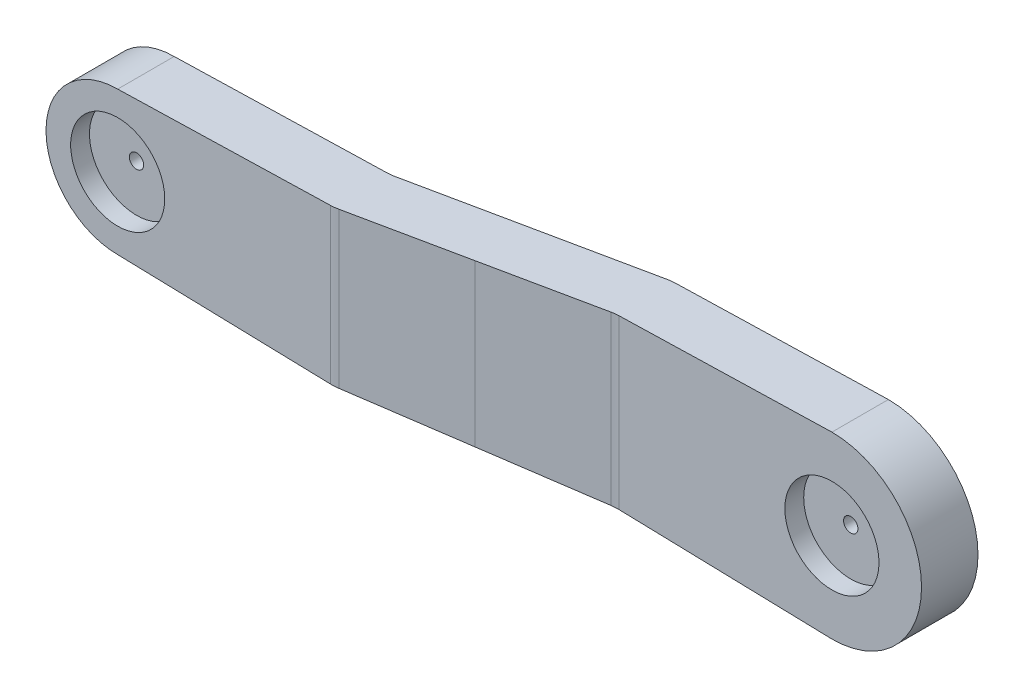
ISO-10303-21;
HEADER;
FILE_DESCRIPTION(('STEP AP214'),'2;1');
FILE_NAME('part.step','',(''),(''),'','','');
FILE_SCHEMA(('AUTOMOTIVE_DESIGN { 1 0 10303 214 1 1 1 1 }'));
ENDSEC;
DATA;
#1=APPLICATION_CONTEXT('core data for automotive mechanical design processes');
#2=APPLICATION_PROTOCOL_DEFINITION('international standard','automotive_design',2000,#1);
#3=PRODUCT_CONTEXT('',#1,'mechanical');
#4=PRODUCT('Part','Part','',(#3));
#5=PRODUCT_RELATED_PRODUCT_CATEGORY('part','',(#4));
#6=PRODUCT_DEFINITION_FORMATION('','',#4);
#7=PRODUCT_DEFINITION_CONTEXT('part definition',#1,'design');
#8=PRODUCT_DEFINITION('design','',#6,#7);
#9=PRODUCT_DEFINITION_SHAPE('','',#8);
#10=(LENGTH_UNIT() NAMED_UNIT(*) SI_UNIT(.MILLI.,.METRE.));
#11=(NAMED_UNIT(*) PLANE_ANGLE_UNIT() SI_UNIT($,.RADIAN.));
#12=(NAMED_UNIT(*) SI_UNIT($,.STERADIAN.) SOLID_ANGLE_UNIT());
#13=UNCERTAINTY_MEASURE_WITH_UNIT(LENGTH_MEASURE(1.E-05),#10,'distance_accuracy_value','');
#14=(GEOMETRIC_REPRESENTATION_CONTEXT(3) GLOBAL_UNCERTAINTY_ASSIGNED_CONTEXT((#13)) GLOBAL_UNIT_ASSIGNED_CONTEXT((#10,
#11,#12)) REPRESENTATION_CONTEXT('',''));
#15=CARTESIAN_POINT('',(0.,0.,0.));
#16=DIRECTION('',(0.,0.,1.));
#17=DIRECTION('',(1.,0.,0.));
#18=AXIS2_PLACEMENT_3D('',#15,#16,#17);
#19=CARTESIAN_POINT('',(0.,0.,22.));
#20=DIRECTION('',(0.,0.,-1.));
#21=DIRECTION('',(-1.,0.,0.));
#22=AXIS2_PLACEMENT_3D('',#19,#20,#21);
#23=CYLINDRICAL_SURFACE('',#22,16.);
#24=CARTESIAN_POINT('',(0.,0.,9.4));
#25=DIRECTION('',(0.,0.,-1.));
#26=DIRECTION('',(-1.,0.,0.));
#27=AXIS2_PLACEMENT_3D('',#24,#25,#26);
#28=CIRCLE('',#27,16.);
#29=CARTESIAN_POINT('',(0.,-16.,9.4));
#30=VERTEX_POINT('',#29);
#31=CARTESIAN_POINT('',(0.,16.,9.4));
#32=VERTEX_POINT('',#31);
#33=EDGE_CURVE('E148',#30,#32,#28,.T.);
#34=ORIENTED_EDGE('',*,*,#33,.F.);
#35=DIRECTION('',(0.,0.,-1.));
#36=VECTOR('',#35,1.);
#37=CARTESIAN_POINT('',(0.,-16.,22.));
#38=LINE('',#37,#36);
#39=CARTESIAN_POINT('',(0.,-16.,22.));
#40=VERTEX_POINT('',#39);
#41=EDGE_CURVE('E159',#40,#30,#38,.T.);
#42=ORIENTED_EDGE('',*,*,#41,.F.);
#43=CARTESIAN_POINT('',(0.,0.,22.));
#44=DIRECTION('',(0.,0.,1.));
#45=DIRECTION('',(1.,0.,0.));
#46=AXIS2_PLACEMENT_3D('',#43,#44,#45);
#47=CIRCLE('',#46,16.);
#48=CARTESIAN_POINT('',(0.,16.,22.));
#49=VERTEX_POINT('',#48);
#50=EDGE_CURVE('E268',#49,#40,#47,.T.);
#51=ORIENTED_EDGE('',*,*,#50,.F.);
#52=DIRECTION('',(0.,0.,-1.));
#53=VECTOR('',#52,1.);
#54=CARTESIAN_POINT('',(0.,16.,22.));
#55=LINE('',#54,#53);
#56=EDGE_CURVE('E161',#49,#32,#55,.T.);
#57=ORIENTED_EDGE('',*,*,#56,.T.);
#58=EDGE_LOOP('',(#34,#42,#51,#57));
#59=FACE_BOUND('',#58,.T.);
#60=ADVANCED_FACE('F42',(#59),#23,.T.);
#61=CARTESIAN_POINT('',(150.,0.,22.));
#62=DIRECTION('',(0.,0.,-1.));
#63=DIRECTION('',(-1.,0.,0.));
#64=AXIS2_PLACEMENT_3D('',#61,#62,#63);
#65=CYLINDRICAL_SURFACE('',#64,20.);
#66=CARTESIAN_POINT('',(150.,0.,12.6));
#67=DIRECTION('',(0.,0.,1.));
#68=DIRECTION('',(1.,0.,0.));
#69=AXIS2_PLACEMENT_3D('',#66,#67,#68);
#70=CIRCLE('',#69,20.);
#71=CARTESIAN_POINT('',(150.,-20.,12.6));
#72=VERTEX_POINT('',#71);
#73=CARTESIAN_POINT('',(150.,20.,12.6));
#74=VERTEX_POINT('',#73);
#75=EDGE_CURVE('E256',#72,#74,#70,.T.);
#76=ORIENTED_EDGE('',*,*,#75,.F.);
#77=DIRECTION('',(0.,0.,-1.));
#78=VECTOR('',#77,1.);
#79=CARTESIAN_POINT('',(150.,-20.,22.));
#80=LINE('',#79,#78);
#81=CARTESIAN_POINT('',(150.,-20.,0.));
#82=VERTEX_POINT('',#81);
#83=EDGE_CURVE('E169',#72,#82,#80,.T.);
#84=ORIENTED_EDGE('',*,*,#83,.T.);
#85=CARTESIAN_POINT('',(150.,0.,0.));
#86=DIRECTION('',(0.,0.,1.));
#87=DIRECTION('',(1.,0.,0.));
#88=AXIS2_PLACEMENT_3D('',#85,#86,#87);
#89=CIRCLE('',#88,20.);
#90=CARTESIAN_POINT('',(150.,20.,0.));
#91=VERTEX_POINT('',#90);
#92=EDGE_CURVE('E275',#82,#91,#89,.T.);
#93=ORIENTED_EDGE('',*,*,#92,.T.);
#94=DIRECTION('',(0.,0.,-1.));
#95=VECTOR('',#94,1.);
#96=CARTESIAN_POINT('',(150.,20.,22.));
#97=LINE('',#96,#95);
#98=EDGE_CURVE('E175',#74,#91,#97,.T.);
#99=ORIENTED_EDGE('',*,*,#98,.F.);
#100=EDGE_LOOP('',(#76,#84,#93,#99));
#101=FACE_BOUND('',#100,.T.);
#102=ADVANCED_FACE('F282',(#101),#65,.T.);
#103=CARTESIAN_POINT('',(150.,-20.,22.));
#104=DIRECTION('',(0.0266571902389806,0.999644633961771,0.));
#105=DIRECTION('',(-0.999644633961771,0.0266571902389806,0.));
#106=AXIS2_PLACEMENT_3D('',#103,#104,#105);
#107=PLANE('',#106);
#108=DIRECTION('',(-0.984468333130823,0.0262524888834886,0.173588328784053));
#109=VECTOR('',#108,1.);
#110=CARTESIAN_POINT('',(74.0695892170201,-17.9751890457872,4.86405652418145));
#111=LINE('',#110,#109);
#112=CARTESIAN_POINT('',(75.,-18.,4.69999999999999));
#113=VERTEX_POINT('',#112);
#114=CARTESIAN_POINT('',(100.793429410793,-18.6878247842878,0.151922469877921));
#115=VERTEX_POINT('',#114);
#116=EDGE_CURVE('E203',#113,#115,#111,.F.);
#117=ORIENTED_EDGE('',*,*,#116,.T.);
#118=CARTESIAN_POINT('',(102.529911187463,-18.734130964999,10.));
#119=DIRECTION('',(0.0266571902389806,0.999644633961771,0.));
#120=DIRECTION('',(-0.999644633961771,0.0266571902389806,0.));
#121=AXIS2_PLACEMENT_3D('',#118,#119,#120);
#122=ELLIPSE('',#121,10.0035549236814,10.);
#123=CARTESIAN_POINT('',(102.529911187463,-18.734130964999,0.));
#124=VERTEX_POINT('',#123);
#125=EDGE_CURVE('E220',#115,#124,#122,.F.);
#126=ORIENTED_EDGE('',*,*,#125,.T.);
#127=DIRECTION('',(0.999644633961771,-0.0266571902389806,0.));
#128=VECTOR('',#127,1.);
#129=CARTESIAN_POINT('',(150.,-20.,0.));
#130=LINE('',#129,#128);
#131=EDGE_CURVE('E265',#124,#82,#130,.T.);
#132=ORIENTED_EDGE('',*,*,#131,.T.);
#133=ORIENTED_EDGE('',*,*,#83,.F.);
#134=DIRECTION('',(0.999644633961771,-0.0266571902389805,0.));
#135=VECTOR('',#134,1.);
#136=CARTESIAN_POINT('',(75.,-18.,12.6));
#137=LINE('',#136,#135);
#138=CARTESIAN_POINT('',(102.529911187463,-18.734130964999,12.6));
#139=VERTEX_POINT('',#138);
#140=EDGE_CURVE('E237',#139,#72,#137,.T.);
#141=ORIENTED_EDGE('',*,*,#140,.F.);
#142=CARTESIAN_POINT('',(102.529911187463,-18.734130964999,22.6));
#143=DIRECTION('',(0.0266571902389806,0.999644633961771,0.));
#144=DIRECTION('',(0.999644633961771,-0.0266571902389806,0.));
#145=AXIS2_PLACEMENT_3D('',#142,#143,#144);
#146=ELLIPSE('',#145,10.0035549236814,10.);
#147=CARTESIAN_POINT('',(100.793429410794,-18.6878247842878,12.7519224698779));
#148=VERTEX_POINT('',#147);
#149=EDGE_CURVE('E50',#139,#148,#146,.T.);
#150=ORIENTED_EDGE('',*,*,#149,.T.);
#151=DIRECTION('',(-0.984468333130824,0.0262524888834887,0.173588328784047));
#152=VECTOR('',#151,1.);
#153=CARTESIAN_POINT('',(146.936838508609,-19.9183156935629,4.61559446406502));
#154=LINE('',#153,#152);
#155=CARTESIAN_POINT('',(75.,-18.,17.3));
#156=VERTEX_POINT('',#155);
#157=EDGE_CURVE('E189',#148,#156,#154,.T.);
#158=ORIENTED_EDGE('',*,*,#157,.T.);
#159=DIRECTION('',(-0.984468333130823,0.0262524888834886,0.173588328784053));
#160=VECTOR('',#159,1.);
#161=CARTESIAN_POINT('',(74.0695892170201,-17.9751890457872,17.4640565241814));
#162=LINE('',#161,#160);
#163=CARTESIAN_POINT('',(49.2065705892067,-17.3121752157122,21.8480775301221));
#164=VERTEX_POINT('',#163);
#165=EDGE_CURVE('E199',#156,#164,#162,.T.);
#166=ORIENTED_EDGE('',*,*,#165,.T.);
#167=CARTESIAN_POINT('',(47.4700888125374,-17.265869035001,12.));
#168=DIRECTION('',(0.0266571902389806,0.999644633961771,0.));
#169=DIRECTION('',(-0.999644633961771,0.0266571902389806,0.));
#170=AXIS2_PLACEMENT_3D('',#167,#168,#169);
#171=ELLIPSE('',#170,10.0035549236814,10.);
#172=CARTESIAN_POINT('',(47.4700888125374,-17.265869035001,22.));
#173=VERTEX_POINT('',#172);
#174=EDGE_CURVE('E57',#164,#173,#171,.F.);
#175=ORIENTED_EDGE('',*,*,#174,.T.);
#176=DIRECTION('',(0.999644633961771,-0.0266571902389806,0.));
#177=VECTOR('',#176,1.);
#178=CARTESIAN_POINT('',(150.,-20.,22.));
#179=LINE('',#178,#177);
#180=EDGE_CURVE('E166',#40,#173,#179,.T.);
#181=ORIENTED_EDGE('',*,*,#180,.F.);
#182=ORIENTED_EDGE('',*,*,#41,.T.);
#183=DIRECTION('',(-0.999644633961771,0.0266571902389806,0.));
#184=VECTOR('',#183,1.);
#185=CARTESIAN_POINT('',(75.,-18.,9.4));
#186=LINE('',#185,#184);
#187=CARTESIAN_POINT('',(47.4700888125366,-17.265869035001,9.4));
#188=VERTEX_POINT('',#187);
#189=EDGE_CURVE('E144',#188,#30,#186,.T.);
#190=ORIENTED_EDGE('',*,*,#189,.F.);
#191=CARTESIAN_POINT('',(47.4700888125366,-17.265869035001,-0.6));
#192=DIRECTION('',(0.0266571902389806,0.999644633961771,0.));
#193=DIRECTION('',(0.999644633961771,-0.0266571902389806,0.));
#194=AXIS2_PLACEMENT_3D('',#191,#192,#193);
#195=ELLIPSE('',#194,10.0035549236814,10.);
#196=CARTESIAN_POINT('',(49.2065705892058,-17.3121752157122,9.24807753012209));
#197=VERTEX_POINT('',#196);
#198=EDGE_CURVE('E231',#188,#197,#195,.T.);
#199=ORIENTED_EDGE('',*,*,#198,.T.);
#200=DIRECTION('',(0.984468333130824,-0.0262524888834887,-0.173588328784047));
#201=VECTOR('',#200,1.);
#202=CARTESIAN_POINT('',(144.783596628727,-19.8608959100994,-7.6047308965205));
#203=LINE('',#202,#201);
#204=EDGE_CURVE('E194',#197,#113,#203,.T.);
#205=ORIENTED_EDGE('',*,*,#204,.T.);
#206=EDGE_LOOP('',(#117,#126,#132,#133,#141,#150,#158,#166,#175,#181,#182,#190,#199,#205));
#207=FACE_BOUND('',#206,.T.);
#208=ADVANCED_FACE('F165',(#207),#107,.F.);
#209=CARTESIAN_POINT('',(0.,16.,22.));
#210=DIRECTION('',(0.0266571902389806,-0.999644633961771,0.));
#211=DIRECTION('',(0.999644633961771,0.0266571902389806,0.));
#212=AXIS2_PLACEMENT_3D('',#209,#210,#211);
#213=PLANE('',#212);
#214=DIRECTION('',(-0.999644633961771,-0.0266571902389806,0.));
#215=VECTOR('',#214,1.);
#216=CARTESIAN_POINT('',(0.,16.,0.));
#217=LINE('',#216,#215);
#218=CARTESIAN_POINT('',(102.529911187463,18.734130964999,0.));
#219=VERTEX_POINT('',#218);
#220=EDGE_CURVE('E270',#91,#219,#217,.T.);
#221=ORIENTED_EDGE('',*,*,#220,.T.);
#222=CARTESIAN_POINT('',(102.529911187463,18.734130964999,10.));
#223=DIRECTION('',(0.0266571902389806,-0.999644633961771,0.));
#224=DIRECTION('',(0.999644633961771,0.0266571902389806,0.));
#225=AXIS2_PLACEMENT_3D('',#222,#223,#224);
#226=ELLIPSE('',#225,10.0035549236814,10.);
#227=CARTESIAN_POINT('',(100.793429410793,18.6878247842878,0.15192246987792));
#228=VERTEX_POINT('',#227);
#229=EDGE_CURVE('E215',#219,#228,#226,.F.);
#230=ORIENTED_EDGE('',*,*,#229,.T.);
#231=DIRECTION('',(0.984468333130823,0.0262524888834886,-0.173588328784053));
#232=VECTOR('',#231,1.);
#233=CARTESIAN_POINT('',(75.,18.,4.70000000000001));
#234=LINE('',#233,#232);
#235=CARTESIAN_POINT('',(75.,18.,4.69999999999999));
#236=VERTEX_POINT('',#235);
#237=EDGE_CURVE('E205',#228,#236,#234,.F.);
#238=ORIENTED_EDGE('',*,*,#237,.T.);
#239=DIRECTION('',(-0.984468333130824,-0.0262524888834887,0.173588328784047));
#240=VECTOR('',#239,1.);
#241=CARTESIAN_POINT('',(-0.696467187766753,15.9814275416596,18.0473295095158));
#242=LINE('',#241,#240);
#243=CARTESIAN_POINT('',(49.2065705892058,17.3121752157122,9.24807753012209));
#244=VERTEX_POINT('',#243);
#245=EDGE_CURVE('E196',#236,#244,#242,.T.);
#246=ORIENTED_EDGE('',*,*,#245,.T.);
#247=CARTESIAN_POINT('',(47.4700888125366,17.265869035001,-0.6));
#248=DIRECTION('',(0.0266571902389806,-0.999644633961771,0.));
#249=DIRECTION('',(-0.999644633961771,-0.0266571902389806,0.));
#250=AXIS2_PLACEMENT_3D('',#247,#248,#249);
#251=ELLIPSE('',#250,10.0035549236814,10.);
#252=CARTESIAN_POINT('',(47.4700888125365,17.265869035001,9.4));
#253=VERTEX_POINT('',#252);
#254=EDGE_CURVE('E233',#244,#253,#251,.T.);
#255=ORIENTED_EDGE('',*,*,#254,.T.);
#256=DIRECTION('',(0.999644633961771,0.0266571902389806,0.));
#257=VECTOR('',#256,1.);
#258=CARTESIAN_POINT('',(0.,16.,9.4));
#259=LINE('',#258,#257);
#260=EDGE_CURVE('E153',#32,#253,#259,.T.);
#261=ORIENTED_EDGE('',*,*,#260,.F.);
#262=ORIENTED_EDGE('',*,*,#56,.F.);
#263=DIRECTION('',(-0.999644633961771,-0.0266571902389806,0.));
#264=VECTOR('',#263,1.);
#265=CARTESIAN_POINT('',(0.,16.,22.));
#266=LINE('',#265,#264);
#267=CARTESIAN_POINT('',(47.4700888125374,17.265869035001,22.));
#268=VERTEX_POINT('',#267);
#269=EDGE_CURVE('E272',#268,#49,#266,.T.);
#270=ORIENTED_EDGE('',*,*,#269,.F.);
#271=CARTESIAN_POINT('',(47.4700888125374,17.265869035001,12.));
#272=DIRECTION('',(0.0266571902389806,-0.999644633961771,0.));
#273=DIRECTION('',(0.999644633961771,0.0266571902389806,0.));
#274=AXIS2_PLACEMENT_3D('',#271,#272,#273);
#275=ELLIPSE('',#274,10.0035549236814,10.);
#276=CARTESIAN_POINT('',(49.2065705892067,17.3121752157122,21.8480775301221));
#277=VERTEX_POINT('',#276);
#278=EDGE_CURVE('E213',#268,#277,#275,.F.);
#279=ORIENTED_EDGE('',*,*,#278,.T.);
#280=DIRECTION('',(0.984468333130823,0.0262524888834886,-0.173588328784053));
#281=VECTOR('',#280,1.);
#282=CARTESIAN_POINT('',(75.,18.,17.3));
#283=LINE('',#282,#281);
#284=CARTESIAN_POINT('',(75.,18.,17.3));
#285=VERTEX_POINT('',#284);
#286=EDGE_CURVE('E201',#277,#285,#283,.T.);
#287=ORIENTED_EDGE('',*,*,#286,.T.);
#288=DIRECTION('',(0.984468333130824,0.0262524888834887,-0.173588328784047));
#289=VECTOR('',#288,1.);
#290=CARTESIAN_POINT('',(1.4567746921146,16.0388473251231,30.2676548701013));
#291=LINE('',#290,#289);
#292=CARTESIAN_POINT('',(100.793429410794,18.6878247842878,12.7519224698779));
#293=VERTEX_POINT('',#292);
#294=EDGE_CURVE('E191',#285,#293,#291,.T.);
#295=ORIENTED_EDGE('',*,*,#294,.T.);
#296=CARTESIAN_POINT('',(102.529911187463,18.734130964999,22.6));
#297=DIRECTION('',(0.0266571902389806,-0.999644633961771,0.));
#298=DIRECTION('',(-0.999644633961771,-0.0266571902389806,0.));
#299=AXIS2_PLACEMENT_3D('',#296,#297,#298);
#300=ELLIPSE('',#299,10.0035549236814,10.);
#301=CARTESIAN_POINT('',(102.529911187463,18.734130964999,12.6));
#302=VERTEX_POINT('',#301);
#303=EDGE_CURVE('E11',#293,#302,#300,.T.);
#304=ORIENTED_EDGE('',*,*,#303,.T.);
#305=DIRECTION('',(-0.999644633961771,-0.0266571902389805,0.));
#306=VECTOR('',#305,1.);
#307=CARTESIAN_POINT('',(150.,20.,12.6));
#308=LINE('',#307,#306);
#309=EDGE_CURVE('E162',#74,#302,#308,.T.);
#310=ORIENTED_EDGE('',*,*,#309,.F.);
#311=ORIENTED_EDGE('',*,*,#98,.T.);
#312=EDGE_LOOP('',(#221,#230,#238,#246,#255,#261,#262,#270,#279,#287,#295,#304,#310,#311));
#313=FACE_BOUND('',#312,.T.);
#314=ADVANCED_FACE('F251',(#313),#213,.F.);
#315=CARTESIAN_POINT('',(0.,0.,22.));
#316=DIRECTION('',(0.,0.,1.));
#317=DIRECTION('',(1.,0.,0.));
#318=AXIS2_PLACEMENT_3D('',#315,#316,#317);
#319=PLANE('',#318);
#320=ORIENTED_EDGE('',*,*,#180,.T.);
#321=DIRECTION('',(0.,1.,0.));
#322=VECTOR('',#321,1.);
#323=CARTESIAN_POINT('',(47.4700888125374,0.,22.));
#324=LINE('',#323,#322);
#325=EDGE_CURVE('E227',#173,#268,#324,.T.);
#326=ORIENTED_EDGE('',*,*,#325,.T.);
#327=ORIENTED_EDGE('',*,*,#269,.T.);
#328=ORIENTED_EDGE('',*,*,#50,.T.);
#329=EDGE_LOOP('',(#320,#326,#327,#328));
#330=FACE_BOUND('',#329,.T.);
#331=CARTESIAN_POINT('',(0.,0.,22.));
#332=DIRECTION('',(0.,0.,1.));
#333=DIRECTION('',(1.,0.,0.));
#334=AXIS2_PLACEMENT_3D('',#331,#332,#333);
#335=CIRCLE('',#334,10.5);
#336=CARTESIAN_POINT('',(10.5,0.,22.));
#337=VERTEX_POINT('',#336);
#338=EDGE_CURVE('E261',#337,#337,#335,.T.);
#339=ORIENTED_EDGE('',*,*,#338,.F.);
#340=EDGE_LOOP('',(#339));
#341=FACE_BOUND('',#340,.T.);
#342=ADVANCED_FACE('F345',(#330,#341),#319,.T.);
#343=CARTESIAN_POINT('',(0.,0.,0.));
#344=DIRECTION('',(0.,0.,1.));
#345=DIRECTION('',(1.,0.,0.));
#346=AXIS2_PLACEMENT_3D('',#343,#344,#345);
#347=PLANE('',#346);
#348=CARTESIAN_POINT('',(150.,0.,0.));
#349=DIRECTION('',(0.,0.,1.));
#350=DIRECTION('',(1.,0.,0.));
#351=AXIS2_PLACEMENT_3D('',#348,#349,#350);
#352=CIRCLE('',#351,1.59999999999999);
#353=CARTESIAN_POINT('',(151.6,0.,0.));
#354=VERTEX_POINT('',#353);
#355=EDGE_CURVE('E354',#354,#354,#352,.T.);
#356=ORIENTED_EDGE('',*,*,#355,.T.);
#357=EDGE_LOOP('',(#356));
#358=FACE_BOUND('',#357,.T.);
#359=ORIENTED_EDGE('',*,*,#131,.F.);
#360=DIRECTION('',(0.,-1.,0.));
#361=VECTOR('',#360,1.);
#362=CARTESIAN_POINT('',(102.529911187463,18.7108006547254,0.));
#363=LINE('',#362,#361);
#364=EDGE_CURVE('E210',#124,#219,#363,.F.);
#365=ORIENTED_EDGE('',*,*,#364,.T.);
#366=ORIENTED_EDGE('',*,*,#220,.F.);
#367=ORIENTED_EDGE('',*,*,#92,.F.);
#368=EDGE_LOOP('',(#359,#365,#366,#367));
#369=FACE_BOUND('',#368,.T.);
#370=ADVANCED_FACE('F285',(#358,#369),#347,.F.);
#371=CARTESIAN_POINT('',(0.,0.,17.8));
#372=DIRECTION('',(0.,0.,1.));
#373=DIRECTION('',(1.,0.,0.));
#374=AXIS2_PLACEMENT_3D('',#371,#372,#373);
#375=CYLINDRICAL_SURFACE('',#374,10.5);
#376=CARTESIAN_POINT('',(0.,0.,17.8));
#377=DIRECTION('',(0.,0.,1.));
#378=DIRECTION('',(1.,0.,0.));
#379=AXIS2_PLACEMENT_3D('',#376,#377,#378);
#380=CIRCLE('',#379,10.5);
#381=CARTESIAN_POINT('',(10.5,0.,17.8));
#382=VERTEX_POINT('',#381);
#383=EDGE_CURVE('E262',#382,#382,#380,.T.);
#384=ORIENTED_EDGE('',*,*,#383,.F.);
#385=EDGE_LOOP('',(#384));
#386=FACE_BOUND('',#385,.T.);
#387=ORIENTED_EDGE('',*,*,#338,.T.);
#388=EDGE_LOOP('',(#387));
#389=FACE_BOUND('',#388,.T.);
#390=ADVANCED_FACE('F364',(#386,#389),#375,.F.);
#391=CARTESIAN_POINT('',(0.,0.,17.8));
#392=DIRECTION('',(0.,0.,1.));
#393=DIRECTION('',(1.,0.,0.));
#394=AXIS2_PLACEMENT_3D('',#391,#392,#393);
#395=PLANE('',#394);
#396=CARTESIAN_POINT('',(0.,0.,17.8));
#397=DIRECTION('',(0.,0.,1.));
#398=DIRECTION('',(1.,0.,0.));
#399=AXIS2_PLACEMENT_3D('',#396,#397,#398);
#400=CIRCLE('',#399,1.6);
#401=CARTESIAN_POINT('',(1.6,0.,17.8));
#402=VERTEX_POINT('',#401);
#403=EDGE_CURVE('E183',#402,#402,#400,.T.);
#404=ORIENTED_EDGE('',*,*,#403,.F.);
#405=EDGE_LOOP('',(#404));
#406=FACE_BOUND('',#405,.T.);
#407=ORIENTED_EDGE('',*,*,#383,.T.);
#408=EDGE_LOOP('',(#407));
#409=FACE_BOUND('',#408,.T.);
#410=ADVANCED_FACE('F361',(#406,#409),#395,.T.);
#411=CARTESIAN_POINT('',(150.,0.,12.6));
#412=DIRECTION('',(0.,0.,1.));
#413=DIRECTION('',(1.,0.,0.));
#414=AXIS2_PLACEMENT_3D('',#411,#412,#413);
#415=PLANE('',#414);
#416=CARTESIAN_POINT('',(150.,0.,12.6));
#417=DIRECTION('',(0.,0.,-1.));
#418=DIRECTION('',(-1.,0.,0.));
#419=AXIS2_PLACEMENT_3D('',#416,#417,#418);
#420=CIRCLE('',#419,10.5);
#421=CARTESIAN_POINT('',(139.5,0.,12.6));
#422=VERTEX_POINT('',#421);
#423=EDGE_CURVE('E185',#422,#422,#420,.T.);
#424=ORIENTED_EDGE('',*,*,#423,.T.);
#425=EDGE_LOOP('',(#424));
#426=FACE_BOUND('',#425,.T.);
#427=ORIENTED_EDGE('',*,*,#309,.T.);
#428=DIRECTION('',(0.,-1.,0.));
#429=VECTOR('',#428,1.);
#430=CARTESIAN_POINT('',(102.529911187463,0.,12.6));
#431=LINE('',#430,#429);
#432=EDGE_CURVE('E222',#302,#139,#431,.T.);
#433=ORIENTED_EDGE('',*,*,#432,.T.);
#434=ORIENTED_EDGE('',*,*,#140,.T.);
#435=ORIENTED_EDGE('',*,*,#75,.T.);
#436=EDGE_LOOP('',(#427,#433,#434,#435));
#437=FACE_BOUND('',#436,.T.);
#438=ADVANCED_FACE('F254',(#426,#437),#415,.T.);
#439=CARTESIAN_POINT('',(0.,0.,9.4));
#440=DIRECTION('',(0.,0.,-1.));
#441=DIRECTION('',(-1.,0.,0.));
#442=AXIS2_PLACEMENT_3D('',#439,#440,#441);
#443=PLANE('',#442);
#444=CARTESIAN_POINT('',(0.,0.,9.4));
#445=DIRECTION('',(0.,0.,-1.));
#446=DIRECTION('',(-1.,0.,0.));
#447=AXIS2_PLACEMENT_3D('',#444,#445,#446);
#448=CIRCLE('',#447,1.6);
#449=CARTESIAN_POINT('',(-1.6,0.,9.4));
#450=VERTEX_POINT('',#449);
#451=EDGE_CURVE('E182',#450,#450,#448,.T.);
#452=ORIENTED_EDGE('',*,*,#451,.F.);
#453=EDGE_LOOP('',(#452));
#454=FACE_BOUND('',#453,.T.);
#455=ORIENTED_EDGE('',*,*,#260,.T.);
#456=DIRECTION('',(0.,-1.,0.));
#457=VECTOR('',#456,1.);
#458=CARTESIAN_POINT('',(47.4700888125366,0.,9.4));
#459=LINE('',#458,#457);
#460=EDGE_CURVE('E151',#253,#188,#459,.T.);
#461=ORIENTED_EDGE('',*,*,#460,.T.);
#462=ORIENTED_EDGE('',*,*,#189,.T.);
#463=ORIENTED_EDGE('',*,*,#33,.T.);
#464=EDGE_LOOP('',(#455,#461,#462,#463));
#465=FACE_BOUND('',#464,.T.);
#466=ADVANCED_FACE('F147',(#454,#465),#443,.T.);
#467=CARTESIAN_POINT('',(150.,0.,8.4));
#468=DIRECTION('',(0.,0.,1.));
#469=DIRECTION('',(1.,0.,0.));
#470=AXIS2_PLACEMENT_3D('',#467,#468,#469);
#471=CYLINDRICAL_SURFACE('',#470,10.5);
#472=CARTESIAN_POINT('',(150.,0.,8.4));
#473=DIRECTION('',(0.,0.,-1.));
#474=DIRECTION('',(-1.,0.,0.));
#475=AXIS2_PLACEMENT_3D('',#472,#473,#474);
#476=CIRCLE('',#475,10.5);
#477=CARTESIAN_POINT('',(139.5,0.,8.4));
#478=VERTEX_POINT('',#477);
#479=EDGE_CURVE('E347',#478,#478,#476,.T.);
#480=ORIENTED_EDGE('',*,*,#479,.T.);
#481=EDGE_LOOP('',(#480));
#482=FACE_BOUND('',#481,.T.);
#483=ORIENTED_EDGE('',*,*,#423,.F.);
#484=EDGE_LOOP('',(#483));
#485=FACE_BOUND('',#484,.T.);
#486=ADVANCED_FACE('F387',(#482,#485),#471,.F.);
#487=CARTESIAN_POINT('',(150.,0.,8.4));
#488=DIRECTION('',(0.,0.,-1.));
#489=DIRECTION('',(-1.,0.,0.));
#490=AXIS2_PLACEMENT_3D('',#487,#488,#489);
#491=PLANE('',#490);
#492=CARTESIAN_POINT('',(150.,0.,8.4));
#493=DIRECTION('',(0.,0.,-1.));
#494=DIRECTION('',(-1.,0.,0.));
#495=AXIS2_PLACEMENT_3D('',#492,#493,#494);
#496=CIRCLE('',#495,1.59999999999999);
#497=CARTESIAN_POINT('',(148.4,0.,8.4));
#498=VERTEX_POINT('',#497);
#499=EDGE_CURVE('E179',#498,#498,#496,.T.);
#500=ORIENTED_EDGE('',*,*,#499,.T.);
#501=EDGE_LOOP('',(#500));
#502=FACE_BOUND('',#501,.T.);
#503=ORIENTED_EDGE('',*,*,#479,.F.);
#504=EDGE_LOOP('',(#503));
#505=FACE_BOUND('',#504,.T.);
#506=ADVANCED_FACE('F391',(#502,#505),#491,.F.);
#507=CARTESIAN_POINT('',(150.,0.,0.));
#508=DIRECTION('',(0.,0.,1.));
#509=DIRECTION('',(1.,0.,0.));
#510=AXIS2_PLACEMENT_3D('',#507,#508,#509);
#511=CYLINDRICAL_SURFACE('',#510,1.59999999999999);
#512=ORIENTED_EDGE('',*,*,#355,.F.);
#513=EDGE_LOOP('',(#512));
#514=FACE_BOUND('',#513,.T.);
#515=ORIENTED_EDGE('',*,*,#499,.F.);
#516=EDGE_LOOP('',(#515));
#517=FACE_BOUND('',#516,.T.);
#518=ADVANCED_FACE('F395',(#514,#517),#511,.F.);
#519=CARTESIAN_POINT('',(0.,0.,0.));
#520=DIRECTION('',(0.,0.,1.));
#521=DIRECTION('',(1.,0.,0.));
#522=AXIS2_PLACEMENT_3D('',#519,#520,#521);
#523=CYLINDRICAL_SURFACE('',#522,1.6);
#524=ORIENTED_EDGE('',*,*,#451,.T.);
#525=EDGE_LOOP('',(#524));
#526=FACE_BOUND('',#525,.T.);
#527=ORIENTED_EDGE('',*,*,#403,.T.);
#528=EDGE_LOOP('',(#527));
#529=FACE_BOUND('',#528,.T.);
#530=ADVANCED_FACE('F327',(#526,#529),#523,.F.);
#531=CARTESIAN_POINT('',(101.655024552204,0.,12.6));
#532=DIRECTION('',(-0.173648177666924,0.,-0.984807753012209));
#533=DIRECTION('',(0.,-1.,0.));
#534=AXIS2_PLACEMENT_3D('',#531,#532,#533);
#535=PLANE('',#534);
#536=ORIENTED_EDGE('',*,*,#157,.F.);
#537=DIRECTION('',(0.,-1.,0.));
#538=VECTOR('',#537,1.);
#539=CARTESIAN_POINT('',(100.793429410794,0.,12.7519224698779));
#540=LINE('',#539,#538);
#541=EDGE_CURVE('E225',#148,#293,#540,.F.);
#542=ORIENTED_EDGE('',*,*,#541,.T.);
#543=ORIENTED_EDGE('',*,*,#294,.F.);
#544=DIRECTION('',(0.,1.,0.));
#545=VECTOR('',#544,1.);
#546=CARTESIAN_POINT('',(75.,18.,17.3));
#547=LINE('',#546,#545);
#548=EDGE_CURVE('E168',#156,#285,#547,.T.);
#549=ORIENTED_EDGE('',*,*,#548,.F.);
#550=EDGE_LOOP('',(#536,#542,#543,#549));
#551=FACE_BOUND('',#550,.T.);
#552=ADVANCED_FACE('F243',(#551),#535,.F.);
#553=CARTESIAN_POINT('',(48.3449754477958,0.,9.4));
#554=DIRECTION('',(0.173648177666924,0.,0.984807753012209));
#555=DIRECTION('',(0.,-1.,0.));
#556=AXIS2_PLACEMENT_3D('',#553,#554,#555);
#557=PLANE('',#556);
#558=ORIENTED_EDGE('',*,*,#204,.F.);
#559=DIRECTION('',(0.,-1.,0.));
#560=VECTOR('',#559,1.);
#561=CARTESIAN_POINT('',(49.2065705892058,0.,9.24807753012209));
#562=LINE('',#561,#560);
#563=EDGE_CURVE('E208',#197,#244,#562,.F.);
#564=ORIENTED_EDGE('',*,*,#563,.T.);
#565=ORIENTED_EDGE('',*,*,#245,.F.);
#566=DIRECTION('',(0.,1.,0.));
#567=VECTOR('',#566,1.);
#568=CARTESIAN_POINT('',(75.,18.,4.69999999999999));
#569=LINE('',#568,#567);
#570=EDGE_CURVE('E172',#113,#236,#569,.T.);
#571=ORIENTED_EDGE('',*,*,#570,.F.);
#572=EDGE_LOOP('',(#558,#564,#565,#571));
#573=FACE_BOUND('',#572,.T.);
#574=ADVANCED_FACE('F299',(#573),#557,.F.);
#575=CARTESIAN_POINT('',(75.,18.,17.3));
#576=DIRECTION('',(0.17364817766693,0.,0.984807753012208));
#577=DIRECTION('',(0.,1.,0.));
#578=AXIS2_PLACEMENT_3D('',#575,#576,#577);
#579=PLANE('',#578);
#580=ORIENTED_EDGE('',*,*,#286,.F.);
#581=DIRECTION('',(0.,1.,0.));
#582=VECTOR('',#581,1.);
#583=CARTESIAN_POINT('',(49.2065705892067,18.,21.8480775301221));
#584=LINE('',#583,#582);
#585=EDGE_CURVE('E65',#277,#164,#584,.F.);
#586=ORIENTED_EDGE('',*,*,#585,.T.);
#587=ORIENTED_EDGE('',*,*,#165,.F.);
#588=ORIENTED_EDGE('',*,*,#548,.T.);
#589=EDGE_LOOP('',(#580,#586,#587,#588));
#590=FACE_BOUND('',#589,.T.);
#591=ADVANCED_FACE('F311',(#590),#579,.T.);
#592=CARTESIAN_POINT('',(75.,18.,4.70000000000001));
#593=DIRECTION('',(0.17364817766693,0.,0.984807753012208));
#594=DIRECTION('',(0.,-1.,0.));
#595=AXIS2_PLACEMENT_3D('',#592,#593,#594);
#596=PLANE('',#595);
#597=ORIENTED_EDGE('',*,*,#237,.F.);
#598=DIRECTION('',(0.,1.,0.));
#599=VECTOR('',#598,1.);
#600=CARTESIAN_POINT('',(100.793429410793,-18.7108006547254,0.151922469877921));
#601=LINE('',#600,#599);
#602=EDGE_CURVE('E217',#228,#115,#601,.F.);
#603=ORIENTED_EDGE('',*,*,#602,.T.);
#604=ORIENTED_EDGE('',*,*,#116,.F.);
#605=ORIENTED_EDGE('',*,*,#570,.T.);
#606=EDGE_LOOP('',(#597,#603,#604,#605));
#607=FACE_BOUND('',#606,.T.);
#608=ADVANCED_FACE('F294',(#607),#596,.F.);
#609=CARTESIAN_POINT('',(47.4700888125366,0.,-0.6));
#610=DIRECTION('',(0.,-1.,0.));
#611=DIRECTION('',(0.,0.,-1.));
#612=AXIS2_PLACEMENT_3D('',#609,#610,#611);
#613=CYLINDRICAL_SURFACE('',#612,10.);
#614=ORIENTED_EDGE('',*,*,#254,.F.);
#615=ORIENTED_EDGE('',*,*,#563,.F.);
#616=ORIENTED_EDGE('',*,*,#198,.F.);
#617=ORIENTED_EDGE('',*,*,#460,.F.);
#618=EDGE_LOOP('',(#614,#615,#616,#617));
#619=FACE_BOUND('',#618,.T.);
#620=ADVANCED_FACE('F303',(#619),#613,.F.);
#621=CARTESIAN_POINT('',(102.529911187463,0.,10.));
#622=DIRECTION('',(0.,1.,0.));
#623=DIRECTION('',(0.,0.,1.));
#624=AXIS2_PLACEMENT_3D('',#621,#622,#623);
#625=CYLINDRICAL_SURFACE('',#624,10.);
#626=ORIENTED_EDGE('',*,*,#125,.F.);
#627=ORIENTED_EDGE('',*,*,#602,.F.);
#628=ORIENTED_EDGE('',*,*,#229,.F.);
#629=ORIENTED_EDGE('',*,*,#364,.F.);
#630=EDGE_LOOP('',(#626,#627,#628,#629));
#631=FACE_BOUND('',#630,.T.);
#632=ADVANCED_FACE('F289',(#631),#625,.T.);
#633=CARTESIAN_POINT('',(102.529911187463,0.,22.6));
#634=DIRECTION('',(0.,-1.,0.));
#635=DIRECTION('',(0.,0.,-1.));
#636=AXIS2_PLACEMENT_3D('',#633,#634,#635);
#637=CYLINDRICAL_SURFACE('',#636,10.);
#638=ORIENTED_EDGE('',*,*,#303,.F.);
#639=ORIENTED_EDGE('',*,*,#541,.F.);
#640=ORIENTED_EDGE('',*,*,#149,.F.);
#641=ORIENTED_EDGE('',*,*,#432,.F.);
#642=EDGE_LOOP('',(#638,#639,#640,#641));
#643=FACE_BOUND('',#642,.T.);
#644=ADVANCED_FACE('F246',(#643),#637,.F.);
#645=CARTESIAN_POINT('',(47.4700888125374,0.,12.));
#646=DIRECTION('',(0.,1.,0.));
#647=DIRECTION('',(0.,0.,1.));
#648=AXIS2_PLACEMENT_3D('',#645,#646,#647);
#649=CYLINDRICAL_SURFACE('',#648,10.);
#650=ORIENTED_EDGE('',*,*,#174,.F.);
#651=ORIENTED_EDGE('',*,*,#585,.F.);
#652=ORIENTED_EDGE('',*,*,#278,.F.);
#653=ORIENTED_EDGE('',*,*,#325,.F.);
#654=EDGE_LOOP('',(#650,#651,#652,#653));
#655=FACE_BOUND('',#654,.T.);
#656=ADVANCED_FACE('F44',(#655),#649,.T.);
#657=CLOSED_SHELL('',(#60,#102,#208,#314,#342,#370,#390,#410,#438,#466,#486,#506,#518,#530,#552,
#574,#591,#608,#620,#632,#644,#656));
#658=MANIFOLD_SOLID_BREP('B2',#657);
#659=ADVANCED_BREP_SHAPE_REPRESENTATION('',(#18,#658),#14);
#660=SHAPE_DEFINITION_REPRESENTATION(#9,#659);
ENDSEC;
END-ISO-10303-21;
